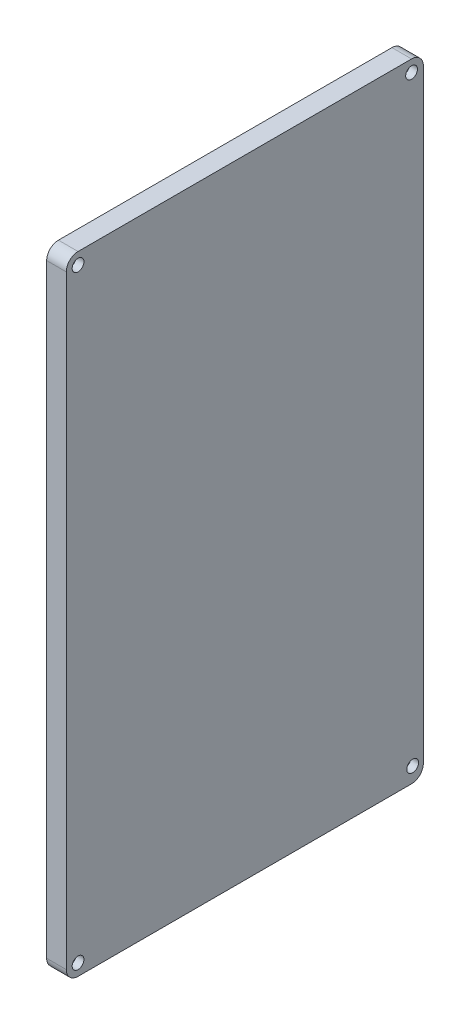
ISO-10303-21;
HEADER;
FILE_DESCRIPTION(('STEP AP214'),'2;1');
FILE_NAME('part.step','',(''),(''),'','','');
FILE_SCHEMA(('AUTOMOTIVE_DESIGN { 1 0 10303 214 1 1 1 1 }'));
ENDSEC;
DATA;
#1=APPLICATION_CONTEXT('core data for automotive mechanical design processes');
#2=APPLICATION_PROTOCOL_DEFINITION('international standard','automotive_design',2000,#1);
#3=PRODUCT_CONTEXT('',#1,'mechanical');
#4=PRODUCT('Part','Part','',(#3));
#5=PRODUCT_RELATED_PRODUCT_CATEGORY('part','',(#4));
#6=PRODUCT_DEFINITION_FORMATION('','',#4);
#7=PRODUCT_DEFINITION_CONTEXT('part definition',#1,'design');
#8=PRODUCT_DEFINITION('design','',#6,#7);
#9=PRODUCT_DEFINITION_SHAPE('','',#8);
#10=(LENGTH_UNIT() NAMED_UNIT(*) SI_UNIT(.MILLI.,.METRE.));
#11=(NAMED_UNIT(*) PLANE_ANGLE_UNIT() SI_UNIT($,.RADIAN.));
#12=(NAMED_UNIT(*) SI_UNIT($,.STERADIAN.) SOLID_ANGLE_UNIT());
#13=UNCERTAINTY_MEASURE_WITH_UNIT(LENGTH_MEASURE(1.E-05),#10,'distance_accuracy_value','');
#14=(GEOMETRIC_REPRESENTATION_CONTEXT(3) GLOBAL_UNCERTAINTY_ASSIGNED_CONTEXT((#13)) GLOBAL_UNIT_ASSIGNED_CONTEXT((#10,
#11,#12)) REPRESENTATION_CONTEXT('',''));
#15=CARTESIAN_POINT('',(0.,0.,0.));
#16=DIRECTION('',(0.,0.,1.));
#17=DIRECTION('',(1.,0.,0.));
#18=AXIS2_PLACEMENT_3D('',#15,#16,#17);
#19=CARTESIAN_POINT('',(-5.,-80.,-45.5));
#20=DIRECTION('',(0.,0.,-1.));
#21=DIRECTION('',(-1.,0.,0.));
#22=AXIS2_PLACEMENT_3D('',#19,#20,#21);
#23=PLANE('',#22);
#24=DIRECTION('',(0.,1.,0.));
#25=VECTOR('',#24,1.);
#26=CARTESIAN_POINT('',(0.,-80.,-45.5));
#27=LINE('',#26,#25);
#28=CARTESIAN_POINT('',(0.,-77.,-45.5));
#29=VERTEX_POINT('',#28);
#30=CARTESIAN_POINT('',(0.,77.,-45.5));
#31=VERTEX_POINT('',#30);
#32=EDGE_CURVE('E215',#29,#31,#27,.T.);
#33=ORIENTED_EDGE('',*,*,#32,.F.);
#34=DIRECTION('',(1.,0.,0.));
#35=VECTOR('',#34,1.);
#36=CARTESIAN_POINT('',(-5.,-77.,-45.5));
#37=LINE('',#36,#35);
#38=CARTESIAN_POINT('',(-5.,-77.,-45.5));
#39=VERTEX_POINT('',#38);
#40=EDGE_CURVE('E159',#29,#39,#37,.F.);
#41=ORIENTED_EDGE('',*,*,#40,.T.);
#42=DIRECTION('',(0.,1.,0.));
#43=VECTOR('',#42,1.);
#44=CARTESIAN_POINT('',(-5.,-80.,-45.5));
#45=LINE('',#44,#43);
#46=CARTESIAN_POINT('',(-5.,77.,-45.5));
#47=VERTEX_POINT('',#46);
#48=EDGE_CURVE('E133',#39,#47,#45,.T.);
#49=ORIENTED_EDGE('',*,*,#48,.T.);
#50=DIRECTION('',(1.,0.,0.));
#51=VECTOR('',#50,1.);
#52=CARTESIAN_POINT('',(-5.,77.,-45.5));
#53=LINE('',#52,#51);
#54=EDGE_CURVE('E155',#47,#31,#53,.T.);
#55=ORIENTED_EDGE('',*,*,#54,.T.);
#56=EDGE_LOOP('',(#33,#41,#49,#55));
#57=FACE_BOUND('',#56,.T.);
#58=ADVANCED_FACE('F42',(#57),#23,.T.);
#59=CARTESIAN_POINT('',(-5.,-80.,45.5));
#60=DIRECTION('',(0.,-1.,0.));
#61=DIRECTION('',(0.,0.,-1.));
#62=AXIS2_PLACEMENT_3D('',#59,#60,#61);
#63=PLANE('',#62);
#64=DIRECTION('',(0.,0.,-1.));
#65=VECTOR('',#64,1.);
#66=CARTESIAN_POINT('',(-5.,-80.,45.5));
#67=LINE('',#66,#65);
#68=CARTESIAN_POINT('',(-5.,-80.,42.5));
#69=VERTEX_POINT('',#68);
#70=CARTESIAN_POINT('',(-5.,-80.,-42.5));
#71=VERTEX_POINT('',#70);
#72=EDGE_CURVE('E139',#69,#71,#67,.T.);
#73=ORIENTED_EDGE('',*,*,#72,.T.);
#74=DIRECTION('',(1.,0.,0.));
#75=VECTOR('',#74,1.);
#76=CARTESIAN_POINT('',(-5.,-80.,-42.5));
#77=LINE('',#76,#75);
#78=CARTESIAN_POINT('',(0.,-80.,-42.5));
#79=VERTEX_POINT('',#78);
#80=EDGE_CURVE('E131',#71,#79,#77,.T.);
#81=ORIENTED_EDGE('',*,*,#80,.T.);
#82=DIRECTION('',(0.,0.,-1.));
#83=VECTOR('',#82,1.);
#84=CARTESIAN_POINT('',(0.,-80.,45.5));
#85=LINE('',#84,#83);
#86=CARTESIAN_POINT('',(0.,-80.,42.5));
#87=VERTEX_POINT('',#86);
#88=EDGE_CURVE('E113',#87,#79,#85,.T.);
#89=ORIENTED_EDGE('',*,*,#88,.F.);
#90=DIRECTION('',(1.,0.,0.));
#91=VECTOR('',#90,1.);
#92=CARTESIAN_POINT('',(-5.,-80.,42.5));
#93=LINE('',#92,#91);
#94=EDGE_CURVE('E128',#87,#69,#93,.F.);
#95=ORIENTED_EDGE('',*,*,#94,.T.);
#96=EDGE_LOOP('',(#73,#81,#89,#95));
#97=FACE_BOUND('',#96,.T.);
#98=ADVANCED_FACE('F127',(#97),#63,.T.);
#99=CARTESIAN_POINT('',(-5.,-80.,45.5));
#100=DIRECTION('',(0.,0.,1.));
#101=DIRECTION('',(1.,0.,0.));
#102=AXIS2_PLACEMENT_3D('',#99,#100,#101);
#103=PLANE('',#102);
#104=DIRECTION('',(0.,-1.,0.));
#105=VECTOR('',#104,1.);
#106=CARTESIAN_POINT('',(-5.,-80.,45.5));
#107=LINE('',#106,#105);
#108=CARTESIAN_POINT('',(-5.,77.,45.5));
#109=VERTEX_POINT('',#108);
#110=CARTESIAN_POINT('',(-5.,-77.,45.5));
#111=VERTEX_POINT('',#110);
#112=EDGE_CURVE('E145',#109,#111,#107,.T.);
#113=ORIENTED_EDGE('',*,*,#112,.T.);
#114=DIRECTION('',(1.,0.,0.));
#115=VECTOR('',#114,1.);
#116=CARTESIAN_POINT('',(-5.,-77.,45.5));
#117=LINE('',#116,#115);
#118=CARTESIAN_POINT('',(0.,-77.,45.5));
#119=VERTEX_POINT('',#118);
#120=EDGE_CURVE('E175',#111,#119,#117,.T.);
#121=ORIENTED_EDGE('',*,*,#120,.T.);
#122=DIRECTION('',(0.,-1.,0.));
#123=VECTOR('',#122,1.);
#124=CARTESIAN_POINT('',(0.,-80.,45.5));
#125=LINE('',#124,#123);
#126=CARTESIAN_POINT('',(0.,77.,45.5));
#127=VERTEX_POINT('',#126);
#128=EDGE_CURVE('E115',#127,#119,#125,.T.);
#129=ORIENTED_EDGE('',*,*,#128,.F.);
#130=DIRECTION('',(1.,0.,0.));
#131=VECTOR('',#130,1.);
#132=CARTESIAN_POINT('',(-5.,77.,45.5));
#133=LINE('',#132,#131);
#134=EDGE_CURVE('E172',#127,#109,#133,.F.);
#135=ORIENTED_EDGE('',*,*,#134,.T.);
#136=EDGE_LOOP('',(#113,#121,#129,#135));
#137=FACE_BOUND('',#136,.T.);
#138=ADVANCED_FACE('F293',(#137),#103,.T.);
#139=CARTESIAN_POINT('',(-5.,80.,45.5));
#140=DIRECTION('',(0.,1.,0.));
#141=DIRECTION('',(0.,0.,1.));
#142=AXIS2_PLACEMENT_3D('',#139,#140,#141);
#143=PLANE('',#142);
#144=DIRECTION('',(0.,0.,1.));
#145=VECTOR('',#144,1.);
#146=CARTESIAN_POINT('',(0.,80.,45.5));
#147=LINE('',#146,#145);
#148=CARTESIAN_POINT('',(0.,80.,-42.5));
#149=VERTEX_POINT('',#148);
#150=CARTESIAN_POINT('',(0.,80.,42.5));
#151=VERTEX_POINT('',#150);
#152=EDGE_CURVE('E233',#149,#151,#147,.T.);
#153=ORIENTED_EDGE('',*,*,#152,.F.);
#154=DIRECTION('',(1.,0.,0.));
#155=VECTOR('',#154,1.);
#156=CARTESIAN_POINT('',(-5.,80.,-42.5));
#157=LINE('',#156,#155);
#158=CARTESIAN_POINT('',(-5.,80.,-42.5));
#159=VERTEX_POINT('',#158);
#160=EDGE_CURVE('E11',#149,#159,#157,.F.);
#161=ORIENTED_EDGE('',*,*,#160,.T.);
#162=DIRECTION('',(0.,0.,1.));
#163=VECTOR('',#162,1.);
#164=CARTESIAN_POINT('',(-5.,80.,45.5));
#165=LINE('',#164,#163);
#166=CARTESIAN_POINT('',(-5.,80.,42.5));
#167=VERTEX_POINT('',#166);
#168=EDGE_CURVE('E224',#159,#167,#165,.T.);
#169=ORIENTED_EDGE('',*,*,#168,.T.);
#170=DIRECTION('',(1.,0.,0.));
#171=VECTOR('',#170,1.);
#172=CARTESIAN_POINT('',(-5.,80.,42.5));
#173=LINE('',#172,#171);
#174=EDGE_CURVE('E52',#167,#151,#173,.T.);
#175=ORIENTED_EDGE('',*,*,#174,.T.);
#176=EDGE_LOOP('',(#153,#161,#169,#175));
#177=FACE_BOUND('',#176,.T.);
#178=ADVANCED_FACE('F298',(#177),#143,.T.);
#179=CARTESIAN_POINT('',(-5.,0.,0.));
#180=DIRECTION('',(-1.,0.,0.));
#181=DIRECTION('',(0.,0.,1.));
#182=AXIS2_PLACEMENT_3D('',#179,#180,#181);
#183=PLANE('',#182);
#184=CARTESIAN_POINT('',(-5.,77.,-42.5));
#185=DIRECTION('',(-1.,0.,0.));
#186=DIRECTION('',(0.,0.,1.));
#187=AXIS2_PLACEMENT_3D('',#184,#185,#186);
#188=CIRCLE('',#187,2.5);
#189=CARTESIAN_POINT('',(-5.,77.,-40.));
#190=VERTEX_POINT('',#189);
#191=EDGE_CURVE('E201',#190,#190,#188,.T.);
#192=ORIENTED_EDGE('',*,*,#191,.F.);
#193=EDGE_LOOP('',(#192));
#194=FACE_BOUND('',#193,.T.);
#195=CARTESIAN_POINT('',(-5.,77.,42.5));
#196=DIRECTION('',(-1.,0.,0.));
#197=DIRECTION('',(0.,0.,1.));
#198=AXIS2_PLACEMENT_3D('',#195,#196,#197);
#199=CIRCLE('',#198,2.5);
#200=CARTESIAN_POINT('',(-5.,77.,45.));
#201=VERTEX_POINT('',#200);
#202=EDGE_CURVE('E244',#201,#201,#199,.T.);
#203=ORIENTED_EDGE('',*,*,#202,.F.);
#204=EDGE_LOOP('',(#203));
#205=FACE_BOUND('',#204,.T.);
#206=CARTESIAN_POINT('',(-5.,-77.,42.5));
#207=DIRECTION('',(-1.,0.,0.));
#208=DIRECTION('',(0.,0.,1.));
#209=AXIS2_PLACEMENT_3D('',#206,#207,#208);
#210=CIRCLE('',#209,2.5);
#211=CARTESIAN_POINT('',(-5.,-77.,45.));
#212=VERTEX_POINT('',#211);
#213=EDGE_CURVE('E220',#212,#212,#210,.T.);
#214=ORIENTED_EDGE('',*,*,#213,.F.);
#215=EDGE_LOOP('',(#214));
#216=FACE_BOUND('',#215,.T.);
#217=CARTESIAN_POINT('',(-5.,-76.1955968995821,-42.7745956580477));
#218=DIRECTION('',(-1.,0.,0.));
#219=DIRECTION('',(0.,0.,1.));
#220=AXIS2_PLACEMENT_3D('',#217,#218,#219);
#221=CIRCLE('',#220,2.5);
#222=CARTESIAN_POINT('',(-5.,-76.1955968995821,-40.2745956580477));
#223=VERTEX_POINT('',#222);
#224=EDGE_CURVE('E216',#223,#223,#221,.T.);
#225=ORIENTED_EDGE('',*,*,#224,.F.);
#226=EDGE_LOOP('',(#225));
#227=FACE_BOUND('',#226,.T.);
#228=ORIENTED_EDGE('',*,*,#48,.F.);
#229=CARTESIAN_POINT('',(-5.,-77.,-42.5));
#230=DIRECTION('',(-1.,0.,0.));
#231=DIRECTION('',(0.,0.,1.));
#232=AXIS2_PLACEMENT_3D('',#229,#230,#231);
#233=CIRCLE('',#232,3.);
#234=EDGE_CURVE('E169',#39,#71,#233,.T.);
#235=ORIENTED_EDGE('',*,*,#234,.T.);
#236=ORIENTED_EDGE('',*,*,#72,.F.);
#237=CARTESIAN_POINT('',(-5.,-77.,42.5));
#238=DIRECTION('',(-1.,0.,0.));
#239=DIRECTION('',(0.,0.,1.));
#240=AXIS2_PLACEMENT_3D('',#237,#238,#239);
#241=CIRCLE('',#240,3.);
#242=EDGE_CURVE('E137',#69,#111,#241,.T.);
#243=ORIENTED_EDGE('',*,*,#242,.T.);
#244=ORIENTED_EDGE('',*,*,#112,.F.);
#245=CARTESIAN_POINT('',(-5.,77.,42.5));
#246=DIRECTION('',(-1.,0.,0.));
#247=DIRECTION('',(0.,0.,1.));
#248=AXIS2_PLACEMENT_3D('',#245,#246,#247);
#249=CIRCLE('',#248,3.);
#250=EDGE_CURVE('E60',#109,#167,#249,.T.);
#251=ORIENTED_EDGE('',*,*,#250,.T.);
#252=ORIENTED_EDGE('',*,*,#168,.F.);
#253=CARTESIAN_POINT('',(-5.,77.,-42.5));
#254=DIRECTION('',(-1.,0.,0.));
#255=DIRECTION('',(0.,0.,1.));
#256=AXIS2_PLACEMENT_3D('',#253,#254,#255);
#257=CIRCLE('',#256,3.);
#258=EDGE_CURVE('E164',#159,#47,#257,.T.);
#259=ORIENTED_EDGE('',*,*,#258,.T.);
#260=EDGE_LOOP('',(#228,#235,#236,#243,#244,#251,#252,#259));
#261=FACE_BOUND('',#260,.T.);
#262=ADVANCED_FACE('F316',(#194,#205,#216,#227,#261),#183,.T.);
#263=CARTESIAN_POINT('',(0.,0.,0.));
#264=DIRECTION('',(-1.,0.,0.));
#265=DIRECTION('',(0.,0.,1.));
#266=AXIS2_PLACEMENT_3D('',#263,#264,#265);
#267=PLANE('',#266);
#268=CARTESIAN_POINT('',(0.,-76.1955968995821,-42.7745956580477));
#269=DIRECTION('',(-1.,0.,0.));
#270=DIRECTION('',(0.,0.,1.));
#271=AXIS2_PLACEMENT_3D('',#268,#269,#270);
#272=CIRCLE('',#271,1.5);
#273=CARTESIAN_POINT('',(0.,-76.1955968995821,-41.2745956580477));
#274=VERTEX_POINT('',#273);
#275=EDGE_CURVE('E46',#274,#274,#272,.T.);
#276=ORIENTED_EDGE('',*,*,#275,.T.);
#277=EDGE_LOOP('',(#276));
#278=FACE_BOUND('',#277,.T.);
#279=CARTESIAN_POINT('',(0.,-77.,42.5));
#280=DIRECTION('',(-1.,0.,0.));
#281=DIRECTION('',(0.,0.,1.));
#282=AXIS2_PLACEMENT_3D('',#279,#280,#281);
#283=CIRCLE('',#282,1.5);
#284=CARTESIAN_POINT('',(0.,-77.,44.));
#285=VERTEX_POINT('',#284);
#286=EDGE_CURVE('E189',#285,#285,#283,.T.);
#287=ORIENTED_EDGE('',*,*,#286,.T.);
#288=EDGE_LOOP('',(#287));
#289=FACE_BOUND('',#288,.T.);
#290=CARTESIAN_POINT('',(0.,77.,42.5));
#291=DIRECTION('',(-1.,0.,0.));
#292=DIRECTION('',(0.,0.,1.));
#293=AXIS2_PLACEMENT_3D('',#290,#291,#292);
#294=CIRCLE('',#293,1.5);
#295=CARTESIAN_POINT('',(0.,77.,44.));
#296=VERTEX_POINT('',#295);
#297=EDGE_CURVE('E185',#296,#296,#294,.T.);
#298=ORIENTED_EDGE('',*,*,#297,.T.);
#299=EDGE_LOOP('',(#298));
#300=FACE_BOUND('',#299,.T.);
#301=CARTESIAN_POINT('',(0.,77.,-42.5));
#302=DIRECTION('',(-1.,0.,0.));
#303=DIRECTION('',(0.,0.,1.));
#304=AXIS2_PLACEMENT_3D('',#301,#302,#303);
#305=CIRCLE('',#304,1.5);
#306=CARTESIAN_POINT('',(0.,77.,-41.));
#307=VERTEX_POINT('',#306);
#308=EDGE_CURVE('E181',#307,#307,#305,.T.);
#309=ORIENTED_EDGE('',*,*,#308,.T.);
#310=EDGE_LOOP('',(#309));
#311=FACE_BOUND('',#310,.T.);
#312=ORIENTED_EDGE('',*,*,#88,.T.);
#313=CARTESIAN_POINT('',(0.,-77.,-42.5));
#314=DIRECTION('',(-1.,0.,0.));
#315=DIRECTION('',(0.,0.,1.));
#316=AXIS2_PLACEMENT_3D('',#313,#314,#315);
#317=CIRCLE('',#316,3.);
#318=EDGE_CURVE('E121',#79,#29,#317,.F.);
#319=ORIENTED_EDGE('',*,*,#318,.T.);
#320=ORIENTED_EDGE('',*,*,#32,.T.);
#321=CARTESIAN_POINT('',(0.,77.,-42.5));
#322=DIRECTION('',(-1.,0.,0.));
#323=DIRECTION('',(0.,0.,1.));
#324=AXIS2_PLACEMENT_3D('',#321,#322,#323);
#325=CIRCLE('',#324,3.);
#326=EDGE_CURVE('E122',#31,#149,#325,.F.);
#327=ORIENTED_EDGE('',*,*,#326,.T.);
#328=ORIENTED_EDGE('',*,*,#152,.T.);
#329=CARTESIAN_POINT('',(0.,77.,42.5));
#330=DIRECTION('',(-1.,0.,0.));
#331=DIRECTION('',(0.,0.,1.));
#332=AXIS2_PLACEMENT_3D('',#329,#330,#331);
#333=CIRCLE('',#332,3.);
#334=EDGE_CURVE('E143',#151,#127,#333,.F.);
#335=ORIENTED_EDGE('',*,*,#334,.T.);
#336=ORIENTED_EDGE('',*,*,#128,.T.);
#337=CARTESIAN_POINT('',(0.,-77.,42.5));
#338=DIRECTION('',(-1.,0.,0.));
#339=DIRECTION('',(0.,0.,1.));
#340=AXIS2_PLACEMENT_3D('',#337,#338,#339);
#341=CIRCLE('',#340,3.);
#342=EDGE_CURVE('E110',#119,#87,#341,.F.);
#343=ORIENTED_EDGE('',*,*,#342,.T.);
#344=EDGE_LOOP('',(#312,#319,#320,#327,#328,#335,#336,#343));
#345=FACE_BOUND('',#344,.T.);
#346=ADVANCED_FACE('F112',(#278,#289,#300,#311,#345),#267,.F.);
#347=CARTESIAN_POINT('',(-5.,-77.,-42.5));
#348=DIRECTION('',(1.,0.,0.));
#349=DIRECTION('',(0.,0.,-1.));
#350=AXIS2_PLACEMENT_3D('',#347,#348,#349);
#351=CYLINDRICAL_SURFACE('',#350,3.);
#352=ORIENTED_EDGE('',*,*,#234,.F.);
#353=ORIENTED_EDGE('',*,*,#40,.F.);
#354=ORIENTED_EDGE('',*,*,#318,.F.);
#355=ORIENTED_EDGE('',*,*,#80,.F.);
#356=EDGE_LOOP('',(#352,#353,#354,#355));
#357=FACE_BOUND('',#356,.T.);
#358=ADVANCED_FACE('F300',(#357),#351,.T.);
#359=CARTESIAN_POINT('',(-5.,-77.,42.5));
#360=DIRECTION('',(1.,0.,0.));
#361=DIRECTION('',(0.,0.,-1.));
#362=AXIS2_PLACEMENT_3D('',#359,#360,#361);
#363=CYLINDRICAL_SURFACE('',#362,3.);
#364=ORIENTED_EDGE('',*,*,#242,.F.);
#365=ORIENTED_EDGE('',*,*,#94,.F.);
#366=ORIENTED_EDGE('',*,*,#342,.F.);
#367=ORIENTED_EDGE('',*,*,#120,.F.);
#368=EDGE_LOOP('',(#364,#365,#366,#367));
#369=FACE_BOUND('',#368,.T.);
#370=ADVANCED_FACE('F136',(#369),#363,.T.);
#371=CARTESIAN_POINT('',(-5.,77.,-42.5));
#372=DIRECTION('',(1.,0.,0.));
#373=DIRECTION('',(0.,0.,-1.));
#374=AXIS2_PLACEMENT_3D('',#371,#372,#373);
#375=CYLINDRICAL_SURFACE('',#374,3.);
#376=ORIENTED_EDGE('',*,*,#258,.F.);
#377=ORIENTED_EDGE('',*,*,#160,.F.);
#378=ORIENTED_EDGE('',*,*,#326,.F.);
#379=ORIENTED_EDGE('',*,*,#54,.F.);
#380=EDGE_LOOP('',(#376,#377,#378,#379));
#381=FACE_BOUND('',#380,.T.);
#382=ADVANCED_FACE('F305',(#381),#375,.T.);
#383=CARTESIAN_POINT('',(-5.,77.,42.5));
#384=DIRECTION('',(1.,0.,0.));
#385=DIRECTION('',(0.,0.,-1.));
#386=AXIS2_PLACEMENT_3D('',#383,#384,#385);
#387=CYLINDRICAL_SURFACE('',#386,3.);
#388=ORIENTED_EDGE('',*,*,#250,.F.);
#389=ORIENTED_EDGE('',*,*,#134,.F.);
#390=ORIENTED_EDGE('',*,*,#334,.F.);
#391=ORIENTED_EDGE('',*,*,#174,.F.);
#392=EDGE_LOOP('',(#388,#389,#390,#391));
#393=FACE_BOUND('',#392,.T.);
#394=ADVANCED_FACE('F44',(#393),#387,.T.);
#395=CARTESIAN_POINT('',(-2.,-76.1955968995821,-42.7745956580477));
#396=DIRECTION('',(-1.,0.,0.));
#397=DIRECTION('',(0.,0.,1.));
#398=AXIS2_PLACEMENT_3D('',#395,#396,#397);
#399=CYLINDRICAL_SURFACE('',#398,2.5);
#400=CARTESIAN_POINT('',(-2.,-76.1955968995821,-42.7745956580477));
#401=DIRECTION('',(-1.,0.,0.));
#402=DIRECTION('',(0.,0.,1.));
#403=AXIS2_PLACEMENT_3D('',#400,#401,#402);
#404=CIRCLE('',#403,2.5);
#405=CARTESIAN_POINT('',(-2.,-76.1955968995821,-40.2745956580477));
#406=VERTEX_POINT('',#405);
#407=EDGE_CURVE('E211',#406,#406,#404,.T.);
#408=ORIENTED_EDGE('',*,*,#407,.F.);
#409=EDGE_LOOP('',(#408));
#410=FACE_BOUND('',#409,.T.);
#411=ORIENTED_EDGE('',*,*,#224,.T.);
#412=EDGE_LOOP('',(#411));
#413=FACE_BOUND('',#412,.T.);
#414=ADVANCED_FACE('F311',(#410,#413),#399,.F.);
#415=CARTESIAN_POINT('',(-2.,-76.1955968995821,-42.7745956580477));
#416=DIRECTION('',(-1.,0.,0.));
#417=DIRECTION('',(0.,0.,1.));
#418=AXIS2_PLACEMENT_3D('',#415,#416,#417);
#419=PLANE('',#418);
#420=CARTESIAN_POINT('',(-2.,-76.1955968995821,-42.7745956580477));
#421=DIRECTION('',(-1.,0.,0.));
#422=DIRECTION('',(0.,0.,1.));
#423=AXIS2_PLACEMENT_3D('',#420,#421,#422);
#424=CIRCLE('',#423,1.5);
#425=CARTESIAN_POINT('',(-2.,-76.1955968995821,-41.2745956580477));
#426=VERTEX_POINT('',#425);
#427=EDGE_CURVE('E257',#426,#426,#424,.T.);
#428=ORIENTED_EDGE('',*,*,#427,.F.);
#429=EDGE_LOOP('',(#428));
#430=FACE_BOUND('',#429,.T.);
#431=ORIENTED_EDGE('',*,*,#407,.T.);
#432=EDGE_LOOP('',(#431));
#433=FACE_BOUND('',#432,.T.);
#434=ADVANCED_FACE('F336',(#430,#433),#419,.T.);
#435=CARTESIAN_POINT('',(-2.,-77.,42.5));
#436=DIRECTION('',(-1.,0.,0.));
#437=DIRECTION('',(0.,0.,1.));
#438=AXIS2_PLACEMENT_3D('',#435,#436,#437);
#439=CYLINDRICAL_SURFACE('',#438,2.5);
#440=CARTESIAN_POINT('',(-2.,-77.,42.5));
#441=DIRECTION('',(-1.,0.,0.));
#442=DIRECTION('',(0.,0.,1.));
#443=AXIS2_PLACEMENT_3D('',#440,#441,#442);
#444=CIRCLE('',#443,2.5);
#445=CARTESIAN_POINT('',(-2.,-77.,45.));
#446=VERTEX_POINT('',#445);
#447=EDGE_CURVE('E240',#446,#446,#444,.T.);
#448=ORIENTED_EDGE('',*,*,#447,.F.);
#449=EDGE_LOOP('',(#448));
#450=FACE_BOUND('',#449,.T.);
#451=ORIENTED_EDGE('',*,*,#213,.T.);
#452=EDGE_LOOP('',(#451));
#453=FACE_BOUND('',#452,.T.);
#454=ADVANCED_FACE('F340',(#450,#453),#439,.F.);
#455=CARTESIAN_POINT('',(-2.,-77.,42.5));
#456=DIRECTION('',(-1.,0.,0.));
#457=DIRECTION('',(0.,0.,1.));
#458=AXIS2_PLACEMENT_3D('',#455,#456,#457);
#459=PLANE('',#458);
#460=CARTESIAN_POINT('',(-2.,-77.,42.5));
#461=DIRECTION('',(-1.,0.,0.));
#462=DIRECTION('',(0.,0.,1.));
#463=AXIS2_PLACEMENT_3D('',#460,#461,#462);
#464=CIRCLE('',#463,1.5);
#465=CARTESIAN_POINT('',(-2.,-77.,44.));
#466=VERTEX_POINT('',#465);
#467=EDGE_CURVE('E261',#466,#466,#464,.T.);
#468=ORIENTED_EDGE('',*,*,#467,.F.);
#469=EDGE_LOOP('',(#468));
#470=FACE_BOUND('',#469,.T.);
#471=ORIENTED_EDGE('',*,*,#447,.T.);
#472=EDGE_LOOP('',(#471));
#473=FACE_BOUND('',#472,.T.);
#474=ADVANCED_FACE('F284',(#470,#473),#459,.T.);
#475=CARTESIAN_POINT('',(-2.,77.,42.5));
#476=DIRECTION('',(-1.,0.,0.));
#477=DIRECTION('',(0.,0.,1.));
#478=AXIS2_PLACEMENT_3D('',#475,#476,#477);
#479=CYLINDRICAL_SURFACE('',#478,2.5);
#480=CARTESIAN_POINT('',(-2.,77.,42.5));
#481=DIRECTION('',(-1.,0.,0.));
#482=DIRECTION('',(0.,0.,1.));
#483=AXIS2_PLACEMENT_3D('',#480,#481,#482);
#484=CIRCLE('',#483,2.5);
#485=CARTESIAN_POINT('',(-2.,77.,45.));
#486=VERTEX_POINT('',#485);
#487=EDGE_CURVE('E207',#486,#486,#484,.T.);
#488=ORIENTED_EDGE('',*,*,#487,.F.);
#489=EDGE_LOOP('',(#488));
#490=FACE_BOUND('',#489,.T.);
#491=ORIENTED_EDGE('',*,*,#202,.T.);
#492=EDGE_LOOP('',(#491));
#493=FACE_BOUND('',#492,.T.);
#494=ADVANCED_FACE('F275',(#490,#493),#479,.F.);
#495=CARTESIAN_POINT('',(-2.,77.,42.5));
#496=DIRECTION('',(-1.,0.,0.));
#497=DIRECTION('',(0.,0.,1.));
#498=AXIS2_PLACEMENT_3D('',#495,#496,#497);
#499=PLANE('',#498);
#500=CARTESIAN_POINT('',(-2.,77.,42.5));
#501=DIRECTION('',(-1.,0.,0.));
#502=DIRECTION('',(0.,0.,1.));
#503=AXIS2_PLACEMENT_3D('',#500,#501,#502);
#504=CIRCLE('',#503,1.5);
#505=CARTESIAN_POINT('',(-2.,77.,44.));
#506=VERTEX_POINT('',#505);
#507=EDGE_CURVE('E256',#506,#506,#504,.T.);
#508=ORIENTED_EDGE('',*,*,#507,.F.);
#509=EDGE_LOOP('',(#508));
#510=FACE_BOUND('',#509,.T.);
#511=ORIENTED_EDGE('',*,*,#487,.T.);
#512=EDGE_LOOP('',(#511));
#513=FACE_BOUND('',#512,.T.);
#514=ADVANCED_FACE('F272',(#510,#513),#499,.T.);
#515=CARTESIAN_POINT('',(-2.,77.,-42.5));
#516=DIRECTION('',(-1.,0.,0.));
#517=DIRECTION('',(0.,0.,1.));
#518=AXIS2_PLACEMENT_3D('',#515,#516,#517);
#519=CYLINDRICAL_SURFACE('',#518,2.5);
#520=CARTESIAN_POINT('',(-2.,77.,-42.5));
#521=DIRECTION('',(-1.,0.,0.));
#522=DIRECTION('',(0.,0.,1.));
#523=AXIS2_PLACEMENT_3D('',#520,#521,#522);
#524=CIRCLE('',#523,2.5);
#525=CARTESIAN_POINT('',(-2.,77.,-40.));
#526=VERTEX_POINT('',#525);
#527=EDGE_CURVE('E196',#526,#526,#524,.T.);
#528=ORIENTED_EDGE('',*,*,#527,.F.);
#529=EDGE_LOOP('',(#528));
#530=FACE_BOUND('',#529,.T.);
#531=ORIENTED_EDGE('',*,*,#191,.T.);
#532=EDGE_LOOP('',(#531));
#533=FACE_BOUND('',#532,.T.);
#534=ADVANCED_FACE('F274',(#530,#533),#519,.F.);
#535=CARTESIAN_POINT('',(-2.,77.,-42.5));
#536=DIRECTION('',(-1.,0.,0.));
#537=DIRECTION('',(0.,0.,1.));
#538=AXIS2_PLACEMENT_3D('',#535,#536,#537);
#539=PLANE('',#538);
#540=CARTESIAN_POINT('',(-2.,77.,-42.5));
#541=DIRECTION('',(-1.,0.,0.));
#542=DIRECTION('',(0.,0.,1.));
#543=AXIS2_PLACEMENT_3D('',#540,#541,#542);
#544=CIRCLE('',#543,1.5);
#545=CARTESIAN_POINT('',(-2.,77.,-41.));
#546=VERTEX_POINT('',#545);
#547=EDGE_CURVE('E186',#546,#546,#544,.T.);
#548=ORIENTED_EDGE('',*,*,#547,.F.);
#549=EDGE_LOOP('',(#548));
#550=FACE_BOUND('',#549,.T.);
#551=ORIENTED_EDGE('',*,*,#527,.T.);
#552=EDGE_LOOP('',(#551));
#553=FACE_BOUND('',#552,.T.);
#554=ADVANCED_FACE('F281',(#550,#553),#539,.T.);
#555=CARTESIAN_POINT('',(3.,77.,-42.5));
#556=DIRECTION('',(-1.,0.,0.));
#557=DIRECTION('',(0.,0.,1.));
#558=AXIS2_PLACEMENT_3D('',#555,#556,#557);
#559=CYLINDRICAL_SURFACE('',#558,1.5);
#560=ORIENTED_EDGE('',*,*,#547,.T.);
#561=EDGE_LOOP('',(#560));
#562=FACE_BOUND('',#561,.T.);
#563=ORIENTED_EDGE('',*,*,#308,.F.);
#564=EDGE_LOOP('',(#563));
#565=FACE_BOUND('',#564,.T.);
#566=ADVANCED_FACE('F343',(#562,#565),#559,.F.);
#567=CARTESIAN_POINT('',(3.,77.,42.5));
#568=DIRECTION('',(-1.,0.,0.));
#569=DIRECTION('',(0.,0.,1.));
#570=AXIS2_PLACEMENT_3D('',#567,#568,#569);
#571=CYLINDRICAL_SURFACE('',#570,1.5);
#572=ORIENTED_EDGE('',*,*,#507,.T.);
#573=EDGE_LOOP('',(#572));
#574=FACE_BOUND('',#573,.T.);
#575=ORIENTED_EDGE('',*,*,#297,.F.);
#576=EDGE_LOOP('',(#575));
#577=FACE_BOUND('',#576,.T.);
#578=ADVANCED_FACE('F269',(#574,#577),#571,.F.);
#579=CARTESIAN_POINT('',(3.,-77.,42.5));
#580=DIRECTION('',(-1.,0.,0.));
#581=DIRECTION('',(0.,0.,1.));
#582=AXIS2_PLACEMENT_3D('',#579,#580,#581);
#583=CYLINDRICAL_SURFACE('',#582,1.5);
#584=ORIENTED_EDGE('',*,*,#467,.T.);
#585=EDGE_LOOP('',(#584));
#586=FACE_BOUND('',#585,.T.);
#587=ORIENTED_EDGE('',*,*,#286,.F.);
#588=EDGE_LOOP('',(#587));
#589=FACE_BOUND('',#588,.T.);
#590=ADVANCED_FACE('F357',(#586,#589),#583,.F.);
#591=CARTESIAN_POINT('',(3.,-76.1955968995821,-42.7745956580477));
#592=DIRECTION('',(-1.,0.,0.));
#593=DIRECTION('',(0.,0.,1.));
#594=AXIS2_PLACEMENT_3D('',#591,#592,#593);
#595=CYLINDRICAL_SURFACE('',#594,1.5);
#596=ORIENTED_EDGE('',*,*,#427,.T.);
#597=EDGE_LOOP('',(#596));
#598=FACE_BOUND('',#597,.T.);
#599=ORIENTED_EDGE('',*,*,#275,.F.);
#600=EDGE_LOOP('',(#599));
#601=FACE_BOUND('',#600,.T.);
#602=ADVANCED_FACE('F361',(#598,#601),#595,.F.);
#603=CLOSED_SHELL('',(#58,#98,#138,#178,#262,#346,#358,#370,#382,#394,#414,#434,#454,#474,#494,
#514,#534,#554,#566,#578,#590,#602));
#604=MANIFOLD_SOLID_BREP('B2',#603);
#605=ADVANCED_BREP_SHAPE_REPRESENTATION('',(#18,#604),#14);
#606=SHAPE_DEFINITION_REPRESENTATION(#9,#605);
ENDSEC;
END-ISO-10303-21;
